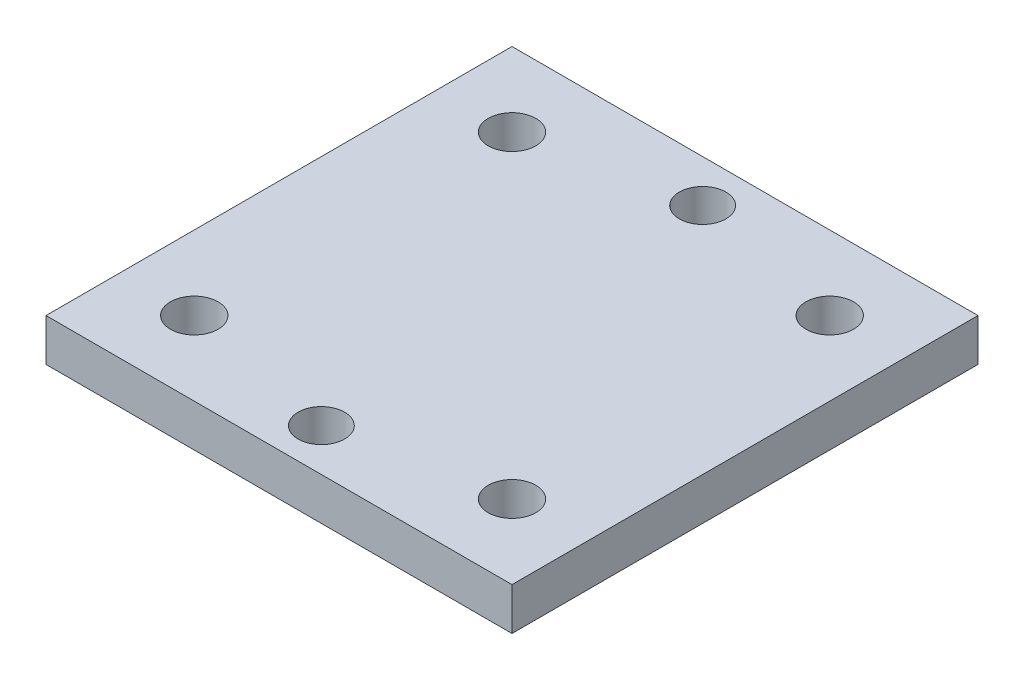
ISO-10303-21;
HEADER;
FILE_DESCRIPTION(('STEP AP214'),'2;1');
FILE_NAME('part.step','',(''),(''),'','','');
FILE_SCHEMA(('AUTOMOTIVE_DESIGN { 1 0 10303 214 1 1 1 1 }'));
ENDSEC;
DATA;
#1=APPLICATION_CONTEXT('core data for automotive mechanical design processes');
#2=APPLICATION_PROTOCOL_DEFINITION('international standard','automotive_design',2000,#1);
#3=PRODUCT_CONTEXT('',#1,'mechanical');
#4=PRODUCT('Part','Part','',(#3));
#5=PRODUCT_RELATED_PRODUCT_CATEGORY('part','',(#4));
#6=PRODUCT_DEFINITION_FORMATION('','',#4);
#7=PRODUCT_DEFINITION_CONTEXT('part definition',#1,'design');
#8=PRODUCT_DEFINITION('design','',#6,#7);
#9=PRODUCT_DEFINITION_SHAPE('','',#8);
#10=(LENGTH_UNIT() NAMED_UNIT(*) SI_UNIT(.MILLI.,.METRE.));
#11=(NAMED_UNIT(*) PLANE_ANGLE_UNIT() SI_UNIT($,.RADIAN.));
#12=(NAMED_UNIT(*) SI_UNIT($,.STERADIAN.) SOLID_ANGLE_UNIT());
#13=UNCERTAINTY_MEASURE_WITH_UNIT(LENGTH_MEASURE(1.E-05),#10,'distance_accuracy_value','');
#14=(GEOMETRIC_REPRESENTATION_CONTEXT(3) GLOBAL_UNCERTAINTY_ASSIGNED_CONTEXT((#13)) GLOBAL_UNIT_ASSIGNED_CONTEXT((#10,
#11,#12)) REPRESENTATION_CONTEXT('',''));
#15=CARTESIAN_POINT('',(0.,0.,0.));
#16=DIRECTION('',(0.,0.,1.));
#17=DIRECTION('',(1.,0.,0.));
#18=AXIS2_PLACEMENT_3D('',#15,#16,#17);
#19=CARTESIAN_POINT('',(-22.,4.,-22.));
#20=DIRECTION('',(1.,0.,0.));
#21=DIRECTION('',(0.,0.,-1.));
#22=AXIS2_PLACEMENT_3D('',#19,#20,#21);
#23=PLANE('',#22);
#24=DIRECTION('',(0.,0.,1.));
#25=VECTOR('',#24,1.);
#26=CARTESIAN_POINT('',(-22.,0.,-22.));
#27=LINE('',#26,#25);
#28=CARTESIAN_POINT('',(-22.,0.,-22.));
#29=VERTEX_POINT('',#28);
#30=CARTESIAN_POINT('',(-22.,0.,22.));
#31=VERTEX_POINT('',#30);
#32=EDGE_CURVE('E105',#29,#31,#27,.T.);
#33=ORIENTED_EDGE('',*,*,#32,.T.);
#34=DIRECTION('',(0.,-1.,0.));
#35=VECTOR('',#34,1.);
#36=CARTESIAN_POINT('',(-22.,4.,22.));
#37=LINE('',#36,#35);
#38=CARTESIAN_POINT('',(-22.,4.,22.));
#39=VERTEX_POINT('',#38);
#40=EDGE_CURVE('E11',#39,#31,#37,.T.);
#41=ORIENTED_EDGE('',*,*,#40,.F.);
#42=DIRECTION('',(0.,0.,1.));
#43=VECTOR('',#42,1.);
#44=CARTESIAN_POINT('',(-22.,4.,-22.));
#45=LINE('',#44,#43);
#46=CARTESIAN_POINT('',(-22.,4.,-22.));
#47=VERTEX_POINT('',#46);
#48=EDGE_CURVE('E89',#47,#39,#45,.T.);
#49=ORIENTED_EDGE('',*,*,#48,.F.);
#50=DIRECTION('',(0.,-1.,0.));
#51=VECTOR('',#50,1.);
#52=CARTESIAN_POINT('',(-22.,4.,-22.));
#53=LINE('',#52,#51);
#54=EDGE_CURVE('E98',#47,#29,#53,.T.);
#55=ORIENTED_EDGE('',*,*,#54,.T.);
#56=EDGE_LOOP('',(#33,#41,#49,#55));
#57=FACE_BOUND('',#56,.T.);
#58=ADVANCED_FACE('F39',(#57),#23,.F.);
#59=CARTESIAN_POINT('',(-22.,4.,22.));
#60=DIRECTION('',(0.,0.,-1.));
#61=DIRECTION('',(-1.,0.,0.));
#62=AXIS2_PLACEMENT_3D('',#59,#60,#61);
#63=PLANE('',#62);
#64=DIRECTION('',(1.,0.,0.));
#65=VECTOR('',#64,1.);
#66=CARTESIAN_POINT('',(-22.,0.,22.));
#67=LINE('',#66,#65);
#68=CARTESIAN_POINT('',(22.,0.,22.));
#69=VERTEX_POINT('',#68);
#70=EDGE_CURVE('E94',#31,#69,#67,.T.);
#71=ORIENTED_EDGE('',*,*,#70,.T.);
#72=DIRECTION('',(0.,-1.,0.));
#73=VECTOR('',#72,1.);
#74=CARTESIAN_POINT('',(22.,4.,22.));
#75=LINE('',#74,#73);
#76=CARTESIAN_POINT('',(22.,4.,22.));
#77=VERTEX_POINT('',#76);
#78=EDGE_CURVE('E50',#77,#69,#75,.T.);
#79=ORIENTED_EDGE('',*,*,#78,.F.);
#80=DIRECTION('',(1.,0.,0.));
#81=VECTOR('',#80,1.);
#82=CARTESIAN_POINT('',(-22.,4.,22.));
#83=LINE('',#82,#81);
#84=EDGE_CURVE('E84',#39,#77,#83,.T.);
#85=ORIENTED_EDGE('',*,*,#84,.F.);
#86=ORIENTED_EDGE('',*,*,#40,.T.);
#87=EDGE_LOOP('',(#71,#79,#85,#86));
#88=FACE_BOUND('',#87,.T.);
#89=ADVANCED_FACE('F91',(#88),#63,.F.);
#90=CARTESIAN_POINT('',(22.,4.,-22.));
#91=DIRECTION('',(-1.,0.,0.));
#92=DIRECTION('',(0.,0.,1.));
#93=AXIS2_PLACEMENT_3D('',#90,#91,#92);
#94=PLANE('',#93);
#95=DIRECTION('',(0.,0.,-1.));
#96=VECTOR('',#95,1.);
#97=CARTESIAN_POINT('',(22.,0.,-22.));
#98=LINE('',#97,#96);
#99=CARTESIAN_POINT('',(22.,0.,-22.));
#100=VERTEX_POINT('',#99);
#101=EDGE_CURVE('E75',#69,#100,#98,.T.);
#102=ORIENTED_EDGE('',*,*,#101,.T.);
#103=DIRECTION('',(0.,-1.,0.));
#104=VECTOR('',#103,1.);
#105=CARTESIAN_POINT('',(22.,4.,-22.));
#106=LINE('',#105,#104);
#107=CARTESIAN_POINT('',(22.,4.,-22.));
#108=VERTEX_POINT('',#107);
#109=EDGE_CURVE('E92',#108,#100,#106,.T.);
#110=ORIENTED_EDGE('',*,*,#109,.F.);
#111=DIRECTION('',(0.,0.,-1.));
#112=VECTOR('',#111,1.);
#113=CARTESIAN_POINT('',(22.,4.,-22.));
#114=LINE('',#113,#112);
#115=EDGE_CURVE('E86',#77,#108,#114,.T.);
#116=ORIENTED_EDGE('',*,*,#115,.F.);
#117=ORIENTED_EDGE('',*,*,#78,.T.);
#118=EDGE_LOOP('',(#102,#110,#116,#117));
#119=FACE_BOUND('',#118,.T.);
#120=ADVANCED_FACE('F96',(#119),#94,.F.);
#121=CARTESIAN_POINT('',(-22.,4.,-22.));
#122=DIRECTION('',(0.,0.,1.));
#123=DIRECTION('',(1.,0.,0.));
#124=AXIS2_PLACEMENT_3D('',#121,#122,#123);
#125=PLANE('',#124);
#126=DIRECTION('',(-1.,0.,0.));
#127=VECTOR('',#126,1.);
#128=CARTESIAN_POINT('',(-22.,0.,-22.));
#129=LINE('',#128,#127);
#130=EDGE_CURVE('E79',#100,#29,#129,.T.);
#131=ORIENTED_EDGE('',*,*,#130,.T.);
#132=ORIENTED_EDGE('',*,*,#54,.F.);
#133=DIRECTION('',(-1.,0.,0.));
#134=VECTOR('',#133,1.);
#135=CARTESIAN_POINT('',(-22.,4.,-22.));
#136=LINE('',#135,#134);
#137=EDGE_CURVE('E54',#108,#47,#136,.T.);
#138=ORIENTED_EDGE('',*,*,#137,.F.);
#139=ORIENTED_EDGE('',*,*,#109,.T.);
#140=EDGE_LOOP('',(#131,#132,#138,#139));
#141=FACE_BOUND('',#140,.T.);
#142=ADVANCED_FACE('F109',(#141),#125,.F.);
#143=CARTESIAN_POINT('',(0.,4.,0.));
#144=DIRECTION('',(0.,1.,0.));
#145=DIRECTION('',(0.,0.,1.));
#146=AXIS2_PLACEMENT_3D('',#143,#144,#145);
#147=PLANE('',#146);
#148=CARTESIAN_POINT('',(0.,4.,18.));
#149=DIRECTION('',(0.,1.,0.));
#150=DIRECTION('',(0.,0.,1.));
#151=AXIS2_PLACEMENT_3D('',#148,#149,#150);
#152=CIRCLE('',#151,2.2);
#153=CARTESIAN_POINT('',(0.,4.,20.2));
#154=VERTEX_POINT('',#153);
#155=EDGE_CURVE('E133',#154,#154,#152,.T.);
#156=ORIENTED_EDGE('',*,*,#155,.F.);
#157=EDGE_LOOP('',(#156));
#158=FACE_BOUND('',#157,.T.);
#159=CARTESIAN_POINT('',(-15.,4.,-15.));
#160=DIRECTION('',(0.,1.,0.));
#161=DIRECTION('',(0.,0.,1.));
#162=AXIS2_PLACEMENT_3D('',#159,#160,#161);
#163=CIRCLE('',#162,2.25);
#164=CARTESIAN_POINT('',(-15.,4.,-12.75));
#165=VERTEX_POINT('',#164);
#166=EDGE_CURVE('E143',#165,#165,#163,.T.);
#167=ORIENTED_EDGE('',*,*,#166,.F.);
#168=EDGE_LOOP('',(#167));
#169=FACE_BOUND('',#168,.T.);
#170=CARTESIAN_POINT('',(15.,4.,-15.));
#171=DIRECTION('',(0.,1.,0.));
#172=DIRECTION('',(0.,0.,1.));
#173=AXIS2_PLACEMENT_3D('',#170,#171,#172);
#174=CIRCLE('',#173,2.25);
#175=CARTESIAN_POINT('',(15.,4.,-12.75));
#176=VERTEX_POINT('',#175);
#177=EDGE_CURVE('E125',#176,#176,#174,.T.);
#178=ORIENTED_EDGE('',*,*,#177,.F.);
#179=EDGE_LOOP('',(#178));
#180=FACE_BOUND('',#179,.T.);
#181=CARTESIAN_POINT('',(-15.,4.,15.));
#182=DIRECTION('',(0.,1.,0.));
#183=DIRECTION('',(0.,0.,1.));
#184=AXIS2_PLACEMENT_3D('',#181,#182,#183);
#185=CIRCLE('',#184,2.25);
#186=CARTESIAN_POINT('',(-15.,4.,17.25));
#187=VERTEX_POINT('',#186);
#188=EDGE_CURVE('E129',#187,#187,#185,.T.);
#189=ORIENTED_EDGE('',*,*,#188,.F.);
#190=EDGE_LOOP('',(#189));
#191=FACE_BOUND('',#190,.T.);
#192=CARTESIAN_POINT('',(0.,4.,-18.));
#193=DIRECTION('',(0.,1.,0.));
#194=DIRECTION('',(0.,0.,1.));
#195=AXIS2_PLACEMENT_3D('',#192,#193,#194);
#196=CIRCLE('',#195,2.2);
#197=CARTESIAN_POINT('',(0.,4.,-15.8));
#198=VERTEX_POINT('',#197);
#199=EDGE_CURVE('E148',#198,#198,#196,.T.);
#200=ORIENTED_EDGE('',*,*,#199,.F.);
#201=EDGE_LOOP('',(#200));
#202=FACE_BOUND('',#201,.T.);
#203=CARTESIAN_POINT('',(15.,4.,15.));
#204=DIRECTION('',(0.,1.,0.));
#205=DIRECTION('',(0.,0.,1.));
#206=AXIS2_PLACEMENT_3D('',#203,#204,#205);
#207=CIRCLE('',#206,2.25);
#208=CARTESIAN_POINT('',(15.,4.,17.25));
#209=VERTEX_POINT('',#208);
#210=EDGE_CURVE('E104',#209,#209,#207,.T.);
#211=ORIENTED_EDGE('',*,*,#210,.F.);
#212=EDGE_LOOP('',(#211));
#213=FACE_BOUND('',#212,.T.);
#214=ORIENTED_EDGE('',*,*,#48,.T.);
#215=ORIENTED_EDGE('',*,*,#84,.T.);
#216=ORIENTED_EDGE('',*,*,#115,.T.);
#217=ORIENTED_EDGE('',*,*,#137,.T.);
#218=EDGE_LOOP('',(#214,#215,#216,#217));
#219=FACE_BOUND('',#218,.T.);
#220=ADVANCED_FACE('F88',(#158,#169,#180,#191,#202,#213,#219),#147,.T.);
#221=CARTESIAN_POINT('',(0.,0.,0.));
#222=DIRECTION('',(0.,1.,0.));
#223=DIRECTION('',(0.,0.,1.));
#224=AXIS2_PLACEMENT_3D('',#221,#222,#223);
#225=PLANE('',#224);
#226=CARTESIAN_POINT('',(0.,0.,18.));
#227=DIRECTION('',(0.,1.,0.));
#228=DIRECTION('',(0.,0.,1.));
#229=AXIS2_PLACEMENT_3D('',#226,#227,#228);
#230=CIRCLE('',#229,2.2);
#231=CARTESIAN_POINT('',(0.,0.,20.2));
#232=VERTEX_POINT('',#231);
#233=EDGE_CURVE('E140',#232,#232,#230,.T.);
#234=ORIENTED_EDGE('',*,*,#233,.T.);
#235=EDGE_LOOP('',(#234));
#236=FACE_BOUND('',#235,.T.);
#237=CARTESIAN_POINT('',(-15.,0.,-15.));
#238=DIRECTION('',(0.,1.,0.));
#239=DIRECTION('',(0.,0.,1.));
#240=AXIS2_PLACEMENT_3D('',#237,#238,#239);
#241=CIRCLE('',#240,2.25);
#242=CARTESIAN_POINT('',(-15.,0.,-12.75));
#243=VERTEX_POINT('',#242);
#244=EDGE_CURVE('E127',#243,#243,#241,.T.);
#245=ORIENTED_EDGE('',*,*,#244,.T.);
#246=EDGE_LOOP('',(#245));
#247=FACE_BOUND('',#246,.T.);
#248=CARTESIAN_POINT('',(15.,0.,-15.));
#249=DIRECTION('',(0.,1.,0.));
#250=DIRECTION('',(0.,0.,1.));
#251=AXIS2_PLACEMENT_3D('',#248,#249,#250);
#252=CIRCLE('',#251,2.25);
#253=CARTESIAN_POINT('',(15.,0.,-12.75));
#254=VERTEX_POINT('',#253);
#255=EDGE_CURVE('E124',#254,#254,#252,.T.);
#256=ORIENTED_EDGE('',*,*,#255,.T.);
#257=EDGE_LOOP('',(#256));
#258=FACE_BOUND('',#257,.T.);
#259=CARTESIAN_POINT('',(-15.,0.,15.));
#260=DIRECTION('',(0.,1.,0.));
#261=DIRECTION('',(0.,0.,1.));
#262=AXIS2_PLACEMENT_3D('',#259,#260,#261);
#263=CIRCLE('',#262,2.25);
#264=CARTESIAN_POINT('',(-15.,0.,17.25));
#265=VERTEX_POINT('',#264);
#266=EDGE_CURVE('E118',#265,#265,#263,.T.);
#267=ORIENTED_EDGE('',*,*,#266,.T.);
#268=EDGE_LOOP('',(#267));
#269=FACE_BOUND('',#268,.T.);
#270=CARTESIAN_POINT('',(0.,0.,-18.));
#271=DIRECTION('',(0.,1.,0.));
#272=DIRECTION('',(0.,0.,1.));
#273=AXIS2_PLACEMENT_3D('',#270,#271,#272);
#274=CIRCLE('',#273,2.2);
#275=CARTESIAN_POINT('',(0.,0.,-15.8));
#276=VERTEX_POINT('',#275);
#277=EDGE_CURVE('E138',#276,#276,#274,.T.);
#278=ORIENTED_EDGE('',*,*,#277,.T.);
#279=EDGE_LOOP('',(#278));
#280=FACE_BOUND('',#279,.T.);
#281=CARTESIAN_POINT('',(15.,0.,15.));
#282=DIRECTION('',(0.,1.,0.));
#283=DIRECTION('',(0.,0.,1.));
#284=AXIS2_PLACEMENT_3D('',#281,#282,#283);
#285=CIRCLE('',#284,2.25);
#286=CARTESIAN_POINT('',(15.,0.,17.25));
#287=VERTEX_POINT('',#286);
#288=EDGE_CURVE('E116',#287,#287,#285,.T.);
#289=ORIENTED_EDGE('',*,*,#288,.T.);
#290=EDGE_LOOP('',(#289));
#291=FACE_BOUND('',#290,.T.);
#292=ORIENTED_EDGE('',*,*,#32,.F.);
#293=ORIENTED_EDGE('',*,*,#130,.F.);
#294=ORIENTED_EDGE('',*,*,#101,.F.);
#295=ORIENTED_EDGE('',*,*,#70,.F.);
#296=EDGE_LOOP('',(#292,#293,#294,#295));
#297=FACE_BOUND('',#296,.T.);
#298=ADVANCED_FACE('F114',(#236,#247,#258,#269,#280,#291,#297),#225,.F.);
#299=CARTESIAN_POINT('',(15.,4.,15.));
#300=DIRECTION('',(0.,-1.,0.));
#301=DIRECTION('',(0.,0.,-1.));
#302=AXIS2_PLACEMENT_3D('',#299,#300,#301);
#303=CYLINDRICAL_SURFACE('',#302,2.25);
#304=ORIENTED_EDGE('',*,*,#210,.T.);
#305=EDGE_LOOP('',(#304));
#306=FACE_BOUND('',#305,.T.);
#307=ORIENTED_EDGE('',*,*,#288,.F.);
#308=EDGE_LOOP('',(#307));
#309=FACE_BOUND('',#308,.T.);
#310=ADVANCED_FACE('F160',(#306,#309),#303,.F.);
#311=CARTESIAN_POINT('',(0.,4.,-18.));
#312=DIRECTION('',(0.,-1.,0.));
#313=DIRECTION('',(0.,0.,-1.));
#314=AXIS2_PLACEMENT_3D('',#311,#312,#313);
#315=CYLINDRICAL_SURFACE('',#314,2.2);
#316=ORIENTED_EDGE('',*,*,#199,.T.);
#317=EDGE_LOOP('',(#316));
#318=FACE_BOUND('',#317,.T.);
#319=ORIENTED_EDGE('',*,*,#277,.F.);
#320=EDGE_LOOP('',(#319));
#321=FACE_BOUND('',#320,.T.);
#322=ADVANCED_FACE('F152',(#318,#321),#315,.F.);
#323=CARTESIAN_POINT('',(-15.,4.,15.));
#324=DIRECTION('',(0.,-1.,0.));
#325=DIRECTION('',(0.,0.,-1.));
#326=AXIS2_PLACEMENT_3D('',#323,#324,#325);
#327=CYLINDRICAL_SURFACE('',#326,2.25);
#328=ORIENTED_EDGE('',*,*,#188,.T.);
#329=EDGE_LOOP('',(#328));
#330=FACE_BOUND('',#329,.T.);
#331=ORIENTED_EDGE('',*,*,#266,.F.);
#332=EDGE_LOOP('',(#331));
#333=FACE_BOUND('',#332,.T.);
#334=ADVANCED_FACE('F156',(#330,#333),#327,.F.);
#335=CARTESIAN_POINT('',(15.,4.,-15.));
#336=DIRECTION('',(0.,-1.,0.));
#337=DIRECTION('',(0.,0.,-1.));
#338=AXIS2_PLACEMENT_3D('',#335,#336,#337);
#339=CYLINDRICAL_SURFACE('',#338,2.25);
#340=ORIENTED_EDGE('',*,*,#177,.T.);
#341=EDGE_LOOP('',(#340));
#342=FACE_BOUND('',#341,.T.);
#343=ORIENTED_EDGE('',*,*,#255,.F.);
#344=EDGE_LOOP('',(#343));
#345=FACE_BOUND('',#344,.T.);
#346=ADVANCED_FACE('F163',(#342,#345),#339,.F.);
#347=CARTESIAN_POINT('',(-15.,4.,-15.));
#348=DIRECTION('',(0.,-1.,0.));
#349=DIRECTION('',(0.,0.,-1.));
#350=AXIS2_PLACEMENT_3D('',#347,#348,#349);
#351=CYLINDRICAL_SURFACE('',#350,2.25);
#352=ORIENTED_EDGE('',*,*,#166,.T.);
#353=EDGE_LOOP('',(#352));
#354=FACE_BOUND('',#353,.T.);
#355=ORIENTED_EDGE('',*,*,#244,.F.);
#356=EDGE_LOOP('',(#355));
#357=FACE_BOUND('',#356,.T.);
#358=ADVANCED_FACE('F189',(#354,#357),#351,.F.);
#359=CARTESIAN_POINT('',(0.,4.,18.));
#360=DIRECTION('',(0.,-1.,0.));
#361=DIRECTION('',(0.,0.,-1.));
#362=AXIS2_PLACEMENT_3D('',#359,#360,#361);
#363=CYLINDRICAL_SURFACE('',#362,2.2);
#364=ORIENTED_EDGE('',*,*,#155,.T.);
#365=EDGE_LOOP('',(#364));
#366=FACE_BOUND('',#365,.T.);
#367=ORIENTED_EDGE('',*,*,#233,.F.);
#368=EDGE_LOOP('',(#367));
#369=FACE_BOUND('',#368,.T.);
#370=ADVANCED_FACE('F191',(#366,#369),#363,.F.);
#371=CLOSED_SHELL('',(#58,#89,#120,#142,#220,#298,#310,#322,#334,#346,#358,#370));
#372=MANIFOLD_SOLID_BREP('B2',#371);
#373=ADVANCED_BREP_SHAPE_REPRESENTATION('',(#18,#372),#14);
#374=SHAPE_DEFINITION_REPRESENTATION(#9,#373);
ENDSEC;
END-ISO-10303-21;
